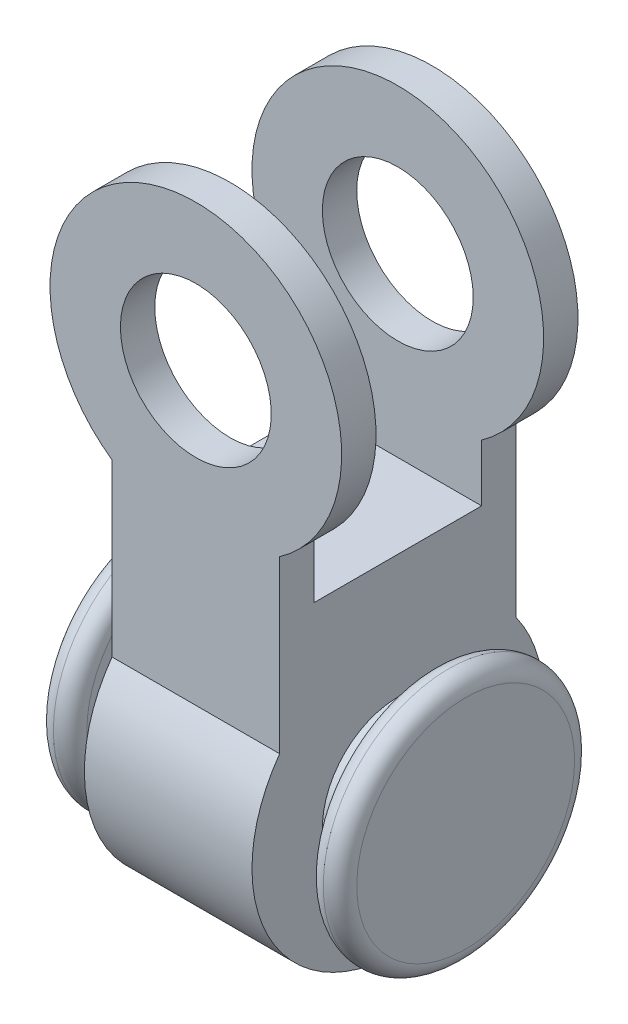
ISO-10303-21;
HEADER;
FILE_DESCRIPTION(('STEP AP214'),'2;1');
FILE_NAME('part.step','',(''),(''),'','','');
FILE_SCHEMA(('AUTOMOTIVE_DESIGN { 1 0 10303 214 1 1 1 1 }'));
ENDSEC;
DATA;
#1=APPLICATION_CONTEXT('core data for automotive mechanical design processes');
#2=APPLICATION_PROTOCOL_DEFINITION('international standard','automotive_design',2000,#1);
#3=PRODUCT_CONTEXT('',#1,'mechanical');
#4=PRODUCT('Part','Part','',(#3));
#5=PRODUCT_RELATED_PRODUCT_CATEGORY('part','',(#4));
#6=PRODUCT_DEFINITION_FORMATION('','',#4);
#7=PRODUCT_DEFINITION_CONTEXT('part definition',#1,'design');
#8=PRODUCT_DEFINITION('design','',#6,#7);
#9=PRODUCT_DEFINITION_SHAPE('','',#8);
#10=(LENGTH_UNIT() NAMED_UNIT(*) SI_UNIT(.MILLI.,.METRE.));
#11=(NAMED_UNIT(*) PLANE_ANGLE_UNIT() SI_UNIT($,.RADIAN.));
#12=(NAMED_UNIT(*) SI_UNIT($,.STERADIAN.) SOLID_ANGLE_UNIT());
#13=UNCERTAINTY_MEASURE_WITH_UNIT(LENGTH_MEASURE(1.E-05),#10,'distance_accuracy_value','');
#14=(GEOMETRIC_REPRESENTATION_CONTEXT(3) GLOBAL_UNCERTAINTY_ASSIGNED_CONTEXT((#13)) GLOBAL_UNIT_ASSIGNED_CONTEXT((#10,
#11,#12)) REPRESENTATION_CONTEXT('',''));
#15=CARTESIAN_POINT('',(0.,0.,0.));
#16=DIRECTION('',(0.,0.,1.));
#17=DIRECTION('',(1.,0.,0.));
#18=AXIS2_PLACEMENT_3D('',#15,#16,#17);
#19=CARTESIAN_POINT('',(50.,224.,70.5));
#20=DIRECTION('',(0.,0.,-1.));
#21=DIRECTION('',(-1.,0.,0.));
#22=AXIS2_PLACEMENT_3D('',#19,#20,#21);
#23=CYLINDRICAL_SURFACE('',#22,87.);
#24=DIRECTION('',(0.,0.,-1.));
#25=VECTOR('',#24,1.);
#26=CARTESIAN_POINT('',(0.,152.80308995469,70.5));
#27=LINE('',#26,#25);
#28=CARTESIAN_POINT('',(0.,152.80308995469,-50.));
#29=VERTEX_POINT('',#28);
#30=CARTESIAN_POINT('',(0.,152.80308995469,-70.5));
#31=VERTEX_POINT('',#30);
#32=EDGE_CURVE('E142',#29,#31,#27,.T.);
#33=ORIENTED_EDGE('',*,*,#32,.F.);
#34=CARTESIAN_POINT('',(50.,224.,-50.));
#35=DIRECTION('',(0.,0.,1.));
#36=DIRECTION('',(1.,0.,0.));
#37=AXIS2_PLACEMENT_3D('',#34,#35,#36);
#38=CIRCLE('',#37,87.);
#39=CARTESIAN_POINT('',(99.9999999999999,152.80308995469,-50.));
#40=VERTEX_POINT('',#39);
#41=EDGE_CURVE('E101',#29,#40,#38,.F.);
#42=ORIENTED_EDGE('',*,*,#41,.T.);
#43=DIRECTION('',(0.,0.,-1.));
#44=VECTOR('',#43,1.);
#45=CARTESIAN_POINT('',(99.9999999999999,152.80308995469,70.5));
#46=LINE('',#45,#44);
#47=CARTESIAN_POINT('',(99.9999999999999,152.80308995469,-70.5));
#48=VERTEX_POINT('',#47);
#49=EDGE_CURVE('E148',#40,#48,#46,.T.);
#50=ORIENTED_EDGE('',*,*,#49,.T.);
#51=CARTESIAN_POINT('',(50.,224.,-70.5));
#52=DIRECTION('',(0.,0.,-1.));
#53=DIRECTION('',(-1.,0.,0.));
#54=AXIS2_PLACEMENT_3D('',#51,#52,#53);
#55=CIRCLE('',#54,87.);
#56=EDGE_CURVE('E136',#31,#48,#55,.T.);
#57=ORIENTED_EDGE('',*,*,#56,.F.);
#58=EDGE_LOOP('',(#33,#42,#50,#57));
#59=FACE_BOUND('',#58,.T.);
#60=ADVANCED_FACE('F33',(#59),#23,.T.);
#61=CARTESIAN_POINT('',(50.,224.,70.5));
#62=DIRECTION('',(0.,0.,-1.));
#63=DIRECTION('',(-1.,0.,0.));
#64=AXIS2_PLACEMENT_3D('',#61,#62,#63);
#65=CYLINDRICAL_SURFACE('',#64,45.);
#66=CARTESIAN_POINT('',(50.,224.,-70.5));
#67=DIRECTION('',(0.,0.,-1.));
#68=DIRECTION('',(-1.,0.,0.));
#69=AXIS2_PLACEMENT_3D('',#66,#67,#68);
#70=CIRCLE('',#69,45.);
#71=CARTESIAN_POINT('',(5.00000000000001,224.,-70.5));
#72=VERTEX_POINT('',#71);
#73=EDGE_CURVE('E132',#72,#72,#70,.T.);
#74=ORIENTED_EDGE('',*,*,#73,.T.);
#75=EDGE_LOOP('',(#74));
#76=FACE_BOUND('',#75,.T.);
#77=CARTESIAN_POINT('',(50.,224.,-50.));
#78=DIRECTION('',(0.,0.,1.));
#79=DIRECTION('',(1.,0.,0.));
#80=AXIS2_PLACEMENT_3D('',#77,#78,#79);
#81=CIRCLE('',#80,45.);
#82=CARTESIAN_POINT('',(95.,224.,-50.));
#83=VERTEX_POINT('',#82);
#84=EDGE_CURVE('E112',#83,#83,#81,.F.);
#85=ORIENTED_EDGE('',*,*,#84,.F.);
#86=EDGE_LOOP('',(#85));
#87=FACE_BOUND('',#86,.T.);
#88=ADVANCED_FACE('F227',(#76,#87),#65,.F.);
#89=CARTESIAN_POINT('',(100.,0.,0.));
#90=DIRECTION('',(-1.,0.,0.));
#91=DIRECTION('',(0.,0.,1.));
#92=AXIS2_PLACEMENT_3D('',#89,#90,#91);
#93=CYLINDRICAL_SURFACE('',#92,87.);
#94=CARTESIAN_POINT('',(0.,0.,0.));
#95=DIRECTION('',(1.,0.,0.));
#96=DIRECTION('',(0.,0.,-1.));
#97=AXIS2_PLACEMENT_3D('',#94,#95,#96);
#98=CIRCLE('',#97,87.);
#99=CARTESIAN_POINT('',(0.,50.9779364038993,70.5));
#100=VERTEX_POINT('',#99);
#101=CARTESIAN_POINT('',(0.,50.9779364038993,-70.5));
#102=VERTEX_POINT('',#101);
#103=EDGE_CURVE('E177',#100,#102,#98,.T.);
#104=ORIENTED_EDGE('',*,*,#103,.T.);
#105=DIRECTION('',(-1.,0.,0.));
#106=VECTOR('',#105,1.);
#107=CARTESIAN_POINT('',(100.,50.9779364038994,-70.4999999999999));
#108=LINE('',#107,#106);
#109=CARTESIAN_POINT('',(100.,50.9779364038993,-70.5));
#110=VERTEX_POINT('',#109);
#111=EDGE_CURVE('E56',#110,#102,#108,.T.);
#112=ORIENTED_EDGE('',*,*,#111,.F.);
#113=CARTESIAN_POINT('',(100.,0.,0.));
#114=DIRECTION('',(1.,0.,0.));
#115=DIRECTION('',(0.,0.,-1.));
#116=AXIS2_PLACEMENT_3D('',#113,#114,#115);
#117=CIRCLE('',#116,87.);
#118=CARTESIAN_POINT('',(100.,50.9779364038993,70.5));
#119=VERTEX_POINT('',#118);
#120=EDGE_CURVE('E182',#119,#110,#117,.T.);
#121=ORIENTED_EDGE('',*,*,#120,.F.);
#122=DIRECTION('',(-1.,0.,0.));
#123=VECTOR('',#122,1.);
#124=CARTESIAN_POINT('',(100.,50.9779364038994,70.4999999999999));
#125=LINE('',#124,#123);
#126=EDGE_CURVE('E160',#100,#119,#125,.F.);
#127=ORIENTED_EDGE('',*,*,#126,.F.);
#128=EDGE_LOOP('',(#104,#112,#121,#127));
#129=FACE_BOUND('',#128,.T.);
#130=ADVANCED_FACE('F225',(#129),#93,.T.);
#131=CARTESIAN_POINT('',(100.,0.,0.));
#132=DIRECTION('',(1.,0.,0.));
#133=DIRECTION('',(0.,0.,-1.));
#134=AXIS2_PLACEMENT_3D('',#131,#132,#133);
#135=PLANE('',#134);
#136=DIRECTION('',(0.,-1.,0.));
#137=VECTOR('',#136,1.);
#138=CARTESIAN_POINT('',(100.,0.,50.));
#139=LINE('',#138,#137);
#140=CARTESIAN_POINT('',(99.9999999999999,152.80308995469,50.));
#141=VERTEX_POINT('',#140);
#142=CARTESIAN_POINT('',(100.,118.8,50.));
#143=VERTEX_POINT('',#142);
#144=EDGE_CURVE('E123',#141,#143,#139,.T.);
#145=ORIENTED_EDGE('',*,*,#144,.F.);
#146=CARTESIAN_POINT('',(99.9999999999999,152.80308995469,70.5));
#147=VERTEX_POINT('',#146);
#148=EDGE_CURVE('E145',#147,#141,#46,.T.);
#149=ORIENTED_EDGE('',*,*,#148,.F.);
#150=DIRECTION('',(0.,1.,0.));
#151=VECTOR('',#150,1.);
#152=CARTESIAN_POINT('',(100.,-87.002,70.5));
#153=LINE('',#152,#151);
#154=EDGE_CURVE('E157',#119,#147,#153,.T.);
#155=ORIENTED_EDGE('',*,*,#154,.F.);
#156=ORIENTED_EDGE('',*,*,#120,.T.);
#157=DIRECTION('',(0.,1.,0.));
#158=VECTOR('',#157,1.);
#159=CARTESIAN_POINT('',(100.,-87.002,-70.5));
#160=LINE('',#159,#158);
#161=EDGE_CURVE('E154',#110,#48,#160,.T.);
#162=ORIENTED_EDGE('',*,*,#161,.T.);
#163=ORIENTED_EDGE('',*,*,#49,.F.);
#164=DIRECTION('',(0.,-1.,0.));
#165=VECTOR('',#164,1.);
#166=CARTESIAN_POINT('',(100.,0.,-50.));
#167=LINE('',#166,#165);
#168=CARTESIAN_POINT('',(100.,118.8,-50.));
#169=VERTEX_POINT('',#168);
#170=EDGE_CURVE('E48',#40,#169,#167,.T.);
#171=ORIENTED_EDGE('',*,*,#170,.T.);
#172=DIRECTION('',(0.,0.,1.));
#173=VECTOR('',#172,1.);
#174=CARTESIAN_POINT('',(100.,118.8,0.));
#175=LINE('',#174,#173);
#176=EDGE_CURVE('E111',#169,#143,#175,.T.);
#177=ORIENTED_EDGE('',*,*,#176,.T.);
#178=EDGE_LOOP('',(#145,#149,#155,#156,#162,#163,#171,#177));
#179=FACE_BOUND('',#178,.T.);
#180=CARTESIAN_POINT('',(100.,0.,0.));
#181=DIRECTION('',(1.,0.,0.));
#182=DIRECTION('',(0.,0.,-1.));
#183=AXIS2_PLACEMENT_3D('',#180,#181,#182);
#184=CIRCLE('',#183,45.);
#185=CARTESIAN_POINT('',(100.,0.,-45.));
#186=VERTEX_POINT('',#185);
#187=EDGE_CURVE('E178',#186,#186,#184,.T.);
#188=ORIENTED_EDGE('',*,*,#187,.F.);
#189=EDGE_LOOP('',(#188));
#190=FACE_BOUND('',#189,.T.);
#191=ADVANCED_FACE('F206',(#179,#190),#135,.T.);
#192=CARTESIAN_POINT('',(0.,0.,0.));
#193=DIRECTION('',(1.,0.,0.));
#194=DIRECTION('',(0.,0.,-1.));
#195=AXIS2_PLACEMENT_3D('',#192,#193,#194);
#196=PLANE('',#195);
#197=CARTESIAN_POINT('',(0.,0.,0.));
#198=DIRECTION('',(-1.,0.,0.));
#199=DIRECTION('',(0.,0.,1.));
#200=AXIS2_PLACEMENT_3D('',#197,#198,#199);
#201=CIRCLE('',#200,45.);
#202=CARTESIAN_POINT('',(0.,0.,45.));
#203=VERTEX_POINT('',#202);
#204=EDGE_CURVE('E169',#203,#203,#201,.T.);
#205=ORIENTED_EDGE('',*,*,#204,.F.);
#206=EDGE_LOOP('',(#205));
#207=FACE_BOUND('',#206,.T.);
#208=CARTESIAN_POINT('',(0.,152.80308995469,70.5));
#209=VERTEX_POINT('',#208);
#210=CARTESIAN_POINT('',(0.,152.80308995469,50.));
#211=VERTEX_POINT('',#210);
#212=EDGE_CURVE('E120',#209,#211,#27,.T.);
#213=ORIENTED_EDGE('',*,*,#212,.T.);
#214=DIRECTION('',(0.,-1.,0.));
#215=VECTOR('',#214,1.);
#216=CARTESIAN_POINT('',(0.,0.,50.));
#217=LINE('',#216,#215);
#218=CARTESIAN_POINT('',(0.,118.8,50.));
#219=VERTEX_POINT('',#218);
#220=EDGE_CURVE('E118',#211,#219,#217,.T.);
#221=ORIENTED_EDGE('',*,*,#220,.T.);
#222=DIRECTION('',(0.,0.,1.));
#223=VECTOR('',#222,1.);
#224=CARTESIAN_POINT('',(0.,118.8,0.));
#225=LINE('',#224,#223);
#226=CARTESIAN_POINT('',(0.,118.8,-50.));
#227=VERTEX_POINT('',#226);
#228=EDGE_CURVE('E11',#227,#219,#225,.T.);
#229=ORIENTED_EDGE('',*,*,#228,.F.);
#230=DIRECTION('',(0.,-1.,0.));
#231=VECTOR('',#230,1.);
#232=CARTESIAN_POINT('',(0.,0.,-50.));
#233=LINE('',#232,#231);
#234=EDGE_CURVE('E96',#29,#227,#233,.T.);
#235=ORIENTED_EDGE('',*,*,#234,.F.);
#236=ORIENTED_EDGE('',*,*,#32,.T.);
#237=DIRECTION('',(0.,1.,0.));
#238=VECTOR('',#237,1.);
#239=CARTESIAN_POINT('',(0.,-87.002,-70.5));
#240=LINE('',#239,#238);
#241=EDGE_CURVE('E151',#102,#31,#240,.T.);
#242=ORIENTED_EDGE('',*,*,#241,.F.);
#243=ORIENTED_EDGE('',*,*,#103,.F.);
#244=DIRECTION('',(0.,1.,0.));
#245=VECTOR('',#244,1.);
#246=CARTESIAN_POINT('',(0.,-87.002,70.5));
#247=LINE('',#246,#245);
#248=EDGE_CURVE('E158',#100,#209,#247,.T.);
#249=ORIENTED_EDGE('',*,*,#248,.T.);
#250=EDGE_LOOP('',(#213,#221,#229,#235,#236,#242,#243,#249));
#251=FACE_BOUND('',#250,.T.);
#252=ADVANCED_FACE('F117',(#207,#251),#196,.F.);
#253=CARTESIAN_POINT('',(120.5,0.,0.));
#254=DIRECTION('',(-1.,0.,0.));
#255=DIRECTION('',(0.,0.,1.));
#256=AXIS2_PLACEMENT_3D('',#253,#254,#255);
#257=CYLINDRICAL_SURFACE('',#256,45.);
#258=CARTESIAN_POINT('',(120.5,0.,0.));
#259=DIRECTION('',(1.,0.,0.));
#260=DIRECTION('',(0.,0.,-1.));
#261=AXIS2_PLACEMENT_3D('',#258,#259,#260);
#262=CIRCLE('',#261,45.);
#263=CARTESIAN_POINT('',(120.5,0.,-45.));
#264=VERTEX_POINT('',#263);
#265=EDGE_CURVE('E174',#264,#264,#262,.T.);
#266=ORIENTED_EDGE('',*,*,#265,.F.);
#267=EDGE_LOOP('',(#266));
#268=FACE_BOUND('',#267,.T.);
#269=ORIENTED_EDGE('',*,*,#187,.T.);
#270=EDGE_LOOP('',(#269));
#271=FACE_BOUND('',#270,.T.);
#272=ADVANCED_FACE('F272',(#268,#271),#257,.T.);
#273=CARTESIAN_POINT('',(140.5,0.,0.));
#274=DIRECTION('',(1.,0.,0.));
#275=DIRECTION('',(0.,0.,-1.));
#276=AXIS2_PLACEMENT_3D('',#273,#274,#275);
#277=PLANE('',#276);
#278=CARTESIAN_POINT('',(140.5,0.,0.));
#279=DIRECTION('',(1.,0.,0.));
#280=DIRECTION('',(0.,0.,-1.));
#281=AXIS2_PLACEMENT_3D('',#278,#279,#280);
#282=CIRCLE('',#281,65.);
#283=CARTESIAN_POINT('',(140.5,0.,-65.));
#284=VERTEX_POINT('',#283);
#285=EDGE_CURVE('E173',#284,#284,#282,.T.);
#286=ORIENTED_EDGE('',*,*,#285,.T.);
#287=EDGE_LOOP('',(#286));
#288=FACE_BOUND('',#287,.T.);
#289=ADVANCED_FACE('F268',(#288),#277,.T.);
#290=CARTESIAN_POINT('',(120.5,0.,0.));
#291=DIRECTION('',(1.,0.,0.));
#292=DIRECTION('',(0.,0.,-1.));
#293=AXIS2_PLACEMENT_3D('',#290,#291,#292);
#294=PLANE('',#293);
#295=CARTESIAN_POINT('',(120.5,0.,0.));
#296=DIRECTION('',(1.,0.,0.));
#297=DIRECTION('',(0.,0.,-1.));
#298=AXIS2_PLACEMENT_3D('',#295,#296,#297);
#299=CIRCLE('',#298,65.);
#300=CARTESIAN_POINT('',(120.5,0.,-65.));
#301=VERTEX_POINT('',#300);
#302=EDGE_CURVE('E181',#301,#301,#299,.F.);
#303=ORIENTED_EDGE('',*,*,#302,.T.);
#304=EDGE_LOOP('',(#303));
#305=FACE_BOUND('',#304,.T.);
#306=ORIENTED_EDGE('',*,*,#265,.T.);
#307=EDGE_LOOP('',(#306));
#308=FACE_BOUND('',#307,.T.);
#309=ADVANCED_FACE('F271',(#305,#308),#294,.F.);
#310=CARTESIAN_POINT('',(130.5,0.,0.));
#311=DIRECTION('',(1.,0.,0.));
#312=DIRECTION('',(0.,0.,-1.));
#313=AXIS2_PLACEMENT_3D('',#310,#311,#312);
#314=TOROIDAL_SURFACE('',#313,65.,10.);
#315=ORIENTED_EDGE('',*,*,#285,.F.);
#316=EDGE_LOOP('',(#315));
#317=FACE_BOUND('',#316,.T.);
#318=CARTESIAN_POINT('',(130.5,0.,0.));
#319=DIRECTION('',(1.,0.,0.));
#320=DIRECTION('',(0.,0.,-1.));
#321=AXIS2_PLACEMENT_3D('',#318,#319,#320);
#322=CIRCLE('',#321,75.);
#323=CARTESIAN_POINT('',(130.5,0.,-75.));
#324=VERTEX_POINT('',#323);
#325=EDGE_CURVE('E168',#324,#324,#322,.F.);
#326=ORIENTED_EDGE('',*,*,#325,.F.);
#327=EDGE_LOOP('',(#326));
#328=FACE_BOUND('',#327,.T.);
#329=ADVANCED_FACE('F276',(#317,#328),#314,.T.);
#330=CARTESIAN_POINT('',(130.5,0.,0.));
#331=DIRECTION('',(1.,0.,0.));
#332=DIRECTION('',(0.,0.,-1.));
#333=AXIS2_PLACEMENT_3D('',#330,#331,#332);
#334=TOROIDAL_SURFACE('',#333,65.,10.);
#335=ORIENTED_EDGE('',*,*,#302,.F.);
#336=EDGE_LOOP('',(#335));
#337=FACE_BOUND('',#336,.T.);
#338=ORIENTED_EDGE('',*,*,#325,.T.);
#339=EDGE_LOOP('',(#338));
#340=FACE_BOUND('',#339,.T.);
#341=ADVANCED_FACE('F266',(#337,#340),#334,.T.);
#342=CARTESIAN_POINT('',(-20.5,0.,0.));
#343=DIRECTION('',(1.,0.,0.));
#344=DIRECTION('',(0.,0.,-1.));
#345=AXIS2_PLACEMENT_3D('',#342,#343,#344);
#346=CYLINDRICAL_SURFACE('',#345,45.);
#347=CARTESIAN_POINT('',(-20.5,0.,0.));
#348=DIRECTION('',(-1.,0.,0.));
#349=DIRECTION('',(0.,0.,1.));
#350=AXIS2_PLACEMENT_3D('',#347,#348,#349);
#351=CIRCLE('',#350,45.);
#352=CARTESIAN_POINT('',(-20.5,0.,45.));
#353=VERTEX_POINT('',#352);
#354=EDGE_CURVE('E165',#353,#353,#351,.T.);
#355=ORIENTED_EDGE('',*,*,#354,.F.);
#356=EDGE_LOOP('',(#355));
#357=FACE_BOUND('',#356,.T.);
#358=ORIENTED_EDGE('',*,*,#204,.T.);
#359=EDGE_LOOP('',(#358));
#360=FACE_BOUND('',#359,.T.);
#361=ADVANCED_FACE('F259',(#357,#360),#346,.T.);
#362=CARTESIAN_POINT('',(-40.5,0.,0.));
#363=DIRECTION('',(-1.,0.,0.));
#364=DIRECTION('',(0.,0.,1.));
#365=AXIS2_PLACEMENT_3D('',#362,#363,#364);
#366=PLANE('',#365);
#367=CARTESIAN_POINT('',(-40.5,0.,0.));
#368=DIRECTION('',(-1.,0.,0.));
#369=DIRECTION('',(0.,0.,1.));
#370=AXIS2_PLACEMENT_3D('',#367,#368,#369);
#371=CIRCLE('',#370,65.);
#372=CARTESIAN_POINT('',(-40.5,0.,65.));
#373=VERTEX_POINT('',#372);
#374=EDGE_CURVE('E41',#373,#373,#371,.T.);
#375=ORIENTED_EDGE('',*,*,#374,.T.);
#376=EDGE_LOOP('',(#375));
#377=FACE_BOUND('',#376,.T.);
#378=ADVANCED_FACE('F255',(#377),#366,.T.);
#379=CARTESIAN_POINT('',(-20.5,0.,0.));
#380=DIRECTION('',(-1.,0.,0.));
#381=DIRECTION('',(0.,0.,1.));
#382=AXIS2_PLACEMENT_3D('',#379,#380,#381);
#383=PLANE('',#382);
#384=CARTESIAN_POINT('',(-20.5,0.,0.));
#385=DIRECTION('',(-1.,0.,0.));
#386=DIRECTION('',(0.,0.,1.));
#387=AXIS2_PLACEMENT_3D('',#384,#385,#386);
#388=CIRCLE('',#387,65.);
#389=CARTESIAN_POINT('',(-20.5,0.,65.));
#390=VERTEX_POINT('',#389);
#391=EDGE_CURVE('E172',#390,#390,#388,.F.);
#392=ORIENTED_EDGE('',*,*,#391,.T.);
#393=EDGE_LOOP('',(#392));
#394=FACE_BOUND('',#393,.T.);
#395=ORIENTED_EDGE('',*,*,#354,.T.);
#396=EDGE_LOOP('',(#395));
#397=FACE_BOUND('',#396,.T.);
#398=ADVANCED_FACE('F258',(#394,#397),#383,.F.);
#399=CARTESIAN_POINT('',(-30.5,0.,0.));
#400=DIRECTION('',(-1.,0.,0.));
#401=DIRECTION('',(0.,0.,1.));
#402=AXIS2_PLACEMENT_3D('',#399,#400,#401);
#403=TOROIDAL_SURFACE('',#402,65.,10.);
#404=ORIENTED_EDGE('',*,*,#374,.F.);
#405=EDGE_LOOP('',(#404));
#406=FACE_BOUND('',#405,.T.);
#407=CARTESIAN_POINT('',(-30.5,0.,0.));
#408=DIRECTION('',(-1.,0.,0.));
#409=DIRECTION('',(0.,0.,1.));
#410=AXIS2_PLACEMENT_3D('',#407,#408,#409);
#411=CIRCLE('',#410,75.);
#412=CARTESIAN_POINT('',(-30.5,0.,75.));
#413=VERTEX_POINT('',#412);
#414=EDGE_CURVE('E164',#413,#413,#411,.F.);
#415=ORIENTED_EDGE('',*,*,#414,.F.);
#416=EDGE_LOOP('',(#415));
#417=FACE_BOUND('',#416,.T.);
#418=ADVANCED_FACE('F35',(#406,#417),#403,.T.);
#419=CARTESIAN_POINT('',(-30.5,0.,0.));
#420=DIRECTION('',(-1.,0.,0.));
#421=DIRECTION('',(0.,0.,1.));
#422=AXIS2_PLACEMENT_3D('',#419,#420,#421);
#423=TOROIDAL_SURFACE('',#422,65.,10.);
#424=ORIENTED_EDGE('',*,*,#391,.F.);
#425=EDGE_LOOP('',(#424));
#426=FACE_BOUND('',#425,.T.);
#427=ORIENTED_EDGE('',*,*,#414,.T.);
#428=EDGE_LOOP('',(#427));
#429=FACE_BOUND('',#428,.T.);
#430=ADVANCED_FACE('F252',(#426,#429),#423,.T.);
#431=CARTESIAN_POINT('',(100.,-87.002,70.5));
#432=DIRECTION('',(0.,0.,1.));
#433=DIRECTION('',(1.,0.,0.));
#434=AXIS2_PLACEMENT_3D('',#431,#432,#433);
#435=PLANE('',#434);
#436=ORIENTED_EDGE('',*,*,#248,.F.);
#437=ORIENTED_EDGE('',*,*,#126,.T.);
#438=ORIENTED_EDGE('',*,*,#154,.T.);
#439=CARTESIAN_POINT('',(50.,224.,70.5));
#440=DIRECTION('',(0.,0.,-1.));
#441=DIRECTION('',(-1.,0.,0.));
#442=AXIS2_PLACEMENT_3D('',#439,#440,#441);
#443=CIRCLE('',#442,87.);
#444=EDGE_CURVE('E139',#209,#147,#443,.T.);
#445=ORIENTED_EDGE('',*,*,#444,.F.);
#446=EDGE_LOOP('',(#436,#437,#438,#445));
#447=FACE_BOUND('',#446,.T.);
#448=CARTESIAN_POINT('',(50.,224.,70.5));
#449=DIRECTION('',(0.,0.,-1.));
#450=DIRECTION('',(-1.,0.,0.));
#451=AXIS2_PLACEMENT_3D('',#448,#449,#450);
#452=CIRCLE('',#451,45.);
#453=CARTESIAN_POINT('',(4.99999999999999,224.,70.5));
#454=VERTEX_POINT('',#453);
#455=EDGE_CURVE('E133',#454,#454,#452,.T.);
#456=ORIENTED_EDGE('',*,*,#455,.T.);
#457=EDGE_LOOP('',(#456));
#458=FACE_BOUND('',#457,.T.);
#459=ADVANCED_FACE('F215',(#447,#458),#435,.T.);
#460=CARTESIAN_POINT('',(100.,-87.002,-70.5));
#461=DIRECTION('',(0.,0.,-1.));
#462=DIRECTION('',(-1.,0.,0.));
#463=AXIS2_PLACEMENT_3D('',#460,#461,#462);
#464=PLANE('',#463);
#465=ORIENTED_EDGE('',*,*,#161,.F.);
#466=ORIENTED_EDGE('',*,*,#111,.T.);
#467=ORIENTED_EDGE('',*,*,#241,.T.);
#468=ORIENTED_EDGE('',*,*,#56,.T.);
#469=EDGE_LOOP('',(#465,#466,#467,#468));
#470=FACE_BOUND('',#469,.T.);
#471=ORIENTED_EDGE('',*,*,#73,.F.);
#472=EDGE_LOOP('',(#471));
#473=FACE_BOUND('',#472,.T.);
#474=ADVANCED_FACE('F220',(#470,#473),#464,.T.);
#475=CARTESIAN_POINT('',(50.,224.,50.));
#476=DIRECTION('',(0.,0.,1.));
#477=DIRECTION('',(1.,0.,0.));
#478=AXIS2_PLACEMENT_3D('',#475,#476,#477);
#479=CIRCLE('',#478,87.);
#480=EDGE_CURVE('E124',#211,#141,#479,.F.);
#481=ORIENTED_EDGE('',*,*,#480,.F.);
#482=ORIENTED_EDGE('',*,*,#212,.F.);
#483=ORIENTED_EDGE('',*,*,#444,.T.);
#484=ORIENTED_EDGE('',*,*,#148,.T.);
#485=EDGE_LOOP('',(#481,#482,#483,#484));
#486=FACE_BOUND('',#485,.T.);
#487=ADVANCED_FACE('F211',(#486),#23,.T.);
#488=CARTESIAN_POINT('',(50.,224.,50.));
#489=DIRECTION('',(0.,0.,1.));
#490=DIRECTION('',(1.,0.,0.));
#491=AXIS2_PLACEMENT_3D('',#488,#489,#490);
#492=CIRCLE('',#491,45.);
#493=CARTESIAN_POINT('',(95.,224.,50.));
#494=VERTEX_POINT('',#493);
#495=EDGE_CURVE('E127',#494,#494,#492,.F.);
#496=ORIENTED_EDGE('',*,*,#495,.T.);
#497=EDGE_LOOP('',(#496));
#498=FACE_BOUND('',#497,.T.);
#499=ORIENTED_EDGE('',*,*,#455,.F.);
#500=EDGE_LOOP('',(#499));
#501=FACE_BOUND('',#500,.T.);
#502=ADVANCED_FACE('F236',(#498,#501),#65,.F.);
#503=CARTESIAN_POINT('',(-40.5000000000001,118.8,-50.));
#504=DIRECTION('',(0.,1.,0.));
#505=DIRECTION('',(-1.,0.,0.));
#506=AXIS2_PLACEMENT_3D('',#503,#504,#505);
#507=PLANE('',#506);
#508=DIRECTION('',(1.,0.,0.));
#509=VECTOR('',#508,1.);
#510=CARTESIAN_POINT('',(-40.5000000000001,118.8,-50.));
#511=LINE('',#510,#509);
#512=EDGE_CURVE('E100',#227,#169,#511,.T.);
#513=ORIENTED_EDGE('',*,*,#512,.F.);
#514=ORIENTED_EDGE('',*,*,#228,.T.);
#515=DIRECTION('',(1.,0.,0.));
#516=VECTOR('',#515,1.);
#517=CARTESIAN_POINT('',(-40.5000000000001,118.8,50.));
#518=LINE('',#517,#516);
#519=EDGE_CURVE('E113',#219,#143,#518,.T.);
#520=ORIENTED_EDGE('',*,*,#519,.T.);
#521=ORIENTED_EDGE('',*,*,#176,.F.);
#522=EDGE_LOOP('',(#513,#514,#520,#521));
#523=FACE_BOUND('',#522,.T.);
#524=ADVANCED_FACE('F107',(#523),#507,.T.);
#525=CARTESIAN_POINT('',(-40.5000000000003,335.569628827252,50.));
#526=DIRECTION('',(0.,0.,1.));
#527=DIRECTION('',(1.,0.,0.));
#528=AXIS2_PLACEMENT_3D('',#525,#526,#527);
#529=PLANE('',#528);
#530=ORIENTED_EDGE('',*,*,#144,.T.);
#531=ORIENTED_EDGE('',*,*,#519,.F.);
#532=ORIENTED_EDGE('',*,*,#220,.F.);
#533=ORIENTED_EDGE('',*,*,#480,.T.);
#534=EDGE_LOOP('',(#530,#531,#532,#533));
#535=FACE_BOUND('',#534,.T.);
#536=ORIENTED_EDGE('',*,*,#495,.F.);
#537=EDGE_LOOP('',(#536));
#538=FACE_BOUND('',#537,.T.);
#539=ADVANCED_FACE('F428',(#535,#538),#529,.F.);
#540=CARTESIAN_POINT('',(-40.5000000000003,335.569628827252,-50.));
#541=DIRECTION('',(0.,0.,1.));
#542=DIRECTION('',(1.,0.,0.));
#543=AXIS2_PLACEMENT_3D('',#540,#541,#542);
#544=PLANE('',#543);
#545=ORIENTED_EDGE('',*,*,#41,.F.);
#546=ORIENTED_EDGE('',*,*,#234,.T.);
#547=ORIENTED_EDGE('',*,*,#512,.T.);
#548=ORIENTED_EDGE('',*,*,#170,.F.);
#549=EDGE_LOOP('',(#545,#546,#547,#548));
#550=FACE_BOUND('',#549,.T.);
#551=ORIENTED_EDGE('',*,*,#84,.T.);
#552=EDGE_LOOP('',(#551));
#553=FACE_BOUND('',#552,.T.);
#554=ADVANCED_FACE('F98',(#550,#553),#544,.T.);
#555=CLOSED_SHELL('',(#60,#88,#130,#191,#252,#272,#289,#309,#329,#341,#361,#378,#398,#418,#430,
#459,#474,#487,#502,#524,#539,#554));
#556=MANIFOLD_SOLID_BREP('B2',#555);
#557=ADVANCED_BREP_SHAPE_REPRESENTATION('',(#18,#556),#14);
#558=SHAPE_DEFINITION_REPRESENTATION(#9,#557);
ENDSEC;
END-ISO-10303-21;
